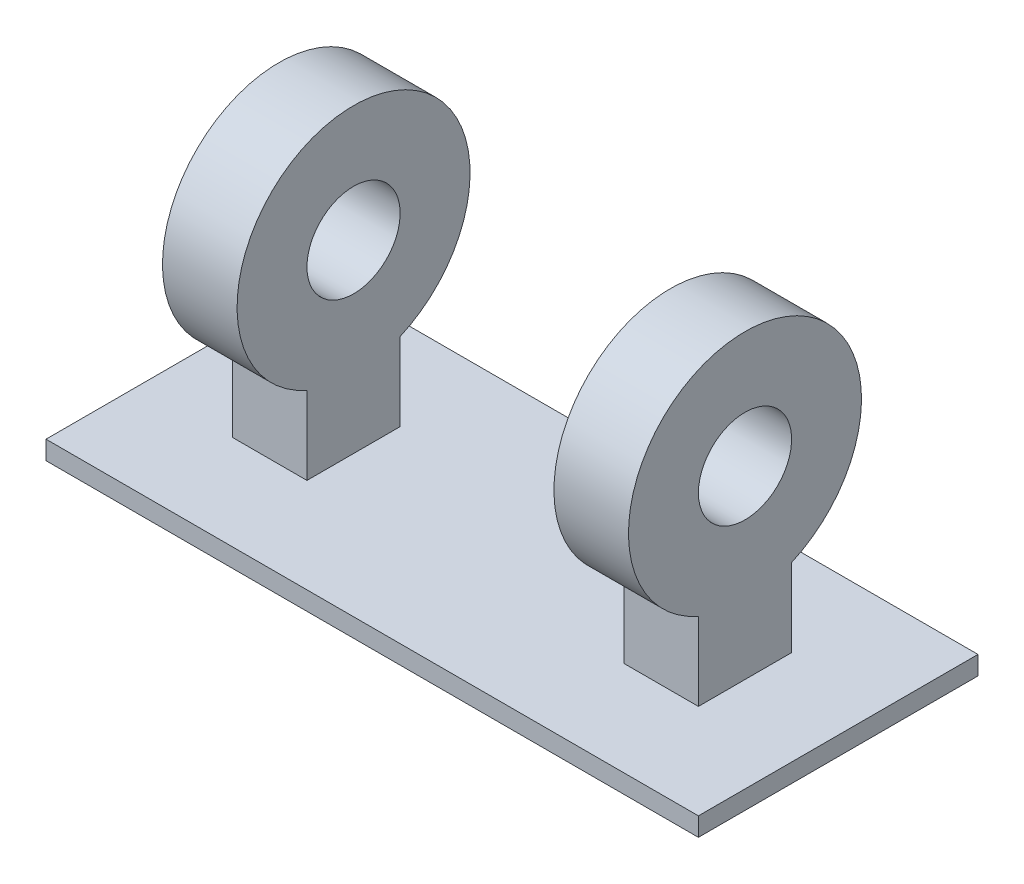
ISO-10303-21;
HEADER;
FILE_DESCRIPTION(('STEP AP214'),'2;1');
FILE_NAME('part.step','',(''),(''),'','','');
FILE_SCHEMA(('AUTOMOTIVE_DESIGN { 1 0 10303 214 1 1 1 1 }'));
ENDSEC;
DATA;
#1=APPLICATION_CONTEXT('core data for automotive mechanical design processes');
#2=APPLICATION_PROTOCOL_DEFINITION('international standard','automotive_design',2000,#1);
#3=PRODUCT_CONTEXT('',#1,'mechanical');
#4=PRODUCT('Part','Part','',(#3));
#5=PRODUCT_RELATED_PRODUCT_CATEGORY('part','',(#4));
#6=PRODUCT_DEFINITION_FORMATION('','',#4);
#7=PRODUCT_DEFINITION_CONTEXT('part definition',#1,'design');
#8=PRODUCT_DEFINITION('design','',#6,#7);
#9=PRODUCT_DEFINITION_SHAPE('','',#8);
#10=(LENGTH_UNIT() NAMED_UNIT(*) SI_UNIT(.MILLI.,.METRE.));
#11=(NAMED_UNIT(*) PLANE_ANGLE_UNIT() SI_UNIT($,.RADIAN.));
#12=(NAMED_UNIT(*) SI_UNIT($,.STERADIAN.) SOLID_ANGLE_UNIT());
#13=UNCERTAINTY_MEASURE_WITH_UNIT(LENGTH_MEASURE(1.E-05),#10,'distance_accuracy_value','');
#14=(GEOMETRIC_REPRESENTATION_CONTEXT(3) GLOBAL_UNCERTAINTY_ASSIGNED_CONTEXT((#13)) GLOBAL_UNIT_ASSIGNED_CONTEXT((#10,
#11,#12)) REPRESENTATION_CONTEXT('',''));
#15=CARTESIAN_POINT('',(0.,0.,0.));
#16=DIRECTION('',(0.,0.,1.));
#17=DIRECTION('',(1.,0.,0.));
#18=AXIS2_PLACEMENT_3D('',#15,#16,#17);
#19=CARTESIAN_POINT('',(17.,2.16649323295984,-5.));
#20=DIRECTION('',(0.,-1.,0.));
#21=DIRECTION('',(0.,0.,-1.));
#22=AXIS2_PLACEMENT_3D('',#19,#20,#21);
#23=PLANE('',#22);
#24=DIRECTION('',(0.,0.,1.));
#25=VECTOR('',#24,1.);
#26=CARTESIAN_POINT('',(25.,2.16649323295984,-5.));
#27=LINE('',#26,#25);
#28=CARTESIAN_POINT('',(25.,2.16649323295984,-5.));
#29=VERTEX_POINT('',#28);
#30=CARTESIAN_POINT('',(25.,2.16649323295984,5.));
#31=VERTEX_POINT('',#30);
#32=EDGE_CURVE('E107',#29,#31,#27,.T.);
#33=ORIENTED_EDGE('',*,*,#32,.T.);
#34=DIRECTION('',(1.,0.,0.));
#35=VECTOR('',#34,1.);
#36=CARTESIAN_POINT('',(17.,2.16649323295984,5.));
#37=LINE('',#36,#35);
#38=CARTESIAN_POINT('',(17.,2.16649323295984,5.));
#39=VERTEX_POINT('',#38);
#40=EDGE_CURVE('E46',#39,#31,#37,.T.);
#41=ORIENTED_EDGE('',*,*,#40,.F.);
#42=DIRECTION('',(0.,0.,1.));
#43=VECTOR('',#42,1.);
#44=CARTESIAN_POINT('',(17.,2.16649323295984,-5.));
#45=LINE('',#44,#43);
#46=CARTESIAN_POINT('',(17.,2.16649323295984,-5.));
#47=VERTEX_POINT('',#46);
#48=EDGE_CURVE('E96',#47,#39,#45,.T.);
#49=ORIENTED_EDGE('',*,*,#48,.F.);
#50=DIRECTION('',(1.,0.,0.));
#51=VECTOR('',#50,1.);
#52=CARTESIAN_POINT('',(17.,2.16649323295984,-5.));
#53=LINE('',#52,#51);
#54=EDGE_CURVE('E12',#47,#29,#53,.T.);
#55=ORIENTED_EDGE('',*,*,#54,.T.);
#56=EDGE_LOOP('',(#33,#41,#49,#55));
#57=FACE_BOUND('',#56,.T.);
#58=ADVANCED_FACE('F43',(#57),#23,.T.);
#59=CARTESIAN_POINT('',(17.,7.0571670620286,-5.));
#60=DIRECTION('',(0.,0.,-1.));
#61=DIRECTION('',(1.,0.,0.));
#62=AXIS2_PLACEMENT_3D('',#59,#60,#61);
#63=PLANE('',#62);
#64=DIRECTION('',(0.,-1.,0.));
#65=VECTOR('',#64,1.);
#66=CARTESIAN_POINT('',(25.,7.0571670620286,-5.));
#67=LINE('',#66,#65);
#68=CARTESIAN_POINT('',(25.,10.5435607626104,-5.));
#69=VERTEX_POINT('',#68);
#70=EDGE_CURVE('E84',#69,#29,#67,.T.);
#71=ORIENTED_EDGE('',*,*,#70,.T.);
#72=ORIENTED_EDGE('',*,*,#54,.F.);
#73=DIRECTION('',(0.,-1.,0.));
#74=VECTOR('',#73,1.);
#75=CARTESIAN_POINT('',(17.,10.5435607626104,-5.));
#76=LINE('',#75,#74);
#77=CARTESIAN_POINT('',(17.,10.5435607626104,-5.));
#78=VERTEX_POINT('',#77);
#79=EDGE_CURVE('E61',#78,#47,#76,.T.);
#80=ORIENTED_EDGE('',*,*,#79,.F.);
#81=DIRECTION('',(1.,0.,0.));
#82=VECTOR('',#81,1.);
#83=CARTESIAN_POINT('',(17.,10.5435607626104,-5.));
#84=LINE('',#83,#82);
#85=EDGE_CURVE('E52',#78,#69,#84,.T.);
#86=ORIENTED_EDGE('',*,*,#85,.T.);
#87=EDGE_LOOP('',(#71,#72,#80,#86));
#88=FACE_BOUND('',#87,.T.);
#89=ADVANCED_FACE('F114',(#88),#63,.T.);
#90=CARTESIAN_POINT('',(17.,22.,0.));
#91=DIRECTION('',(1.,0.,0.));
#92=DIRECTION('',(0.,0.,1.));
#93=AXIS2_PLACEMENT_3D('',#90,#91,#92);
#94=CYLINDRICAL_SURFACE('',#93,12.5);
#95=CARTESIAN_POINT('',(25.,22.,0.));
#96=DIRECTION('',(-1.,0.,0.));
#97=DIRECTION('',(0.,0.,1.));
#98=AXIS2_PLACEMENT_3D('',#95,#96,#97);
#99=CIRCLE('',#98,12.5);
#100=CARTESIAN_POINT('',(25.,10.5435607626104,5.));
#101=VERTEX_POINT('',#100);
#102=EDGE_CURVE('E78',#101,#69,#99,.T.);
#103=ORIENTED_EDGE('',*,*,#102,.T.);
#104=ORIENTED_EDGE('',*,*,#85,.F.);
#105=CARTESIAN_POINT('',(17.,22.,0.));
#106=DIRECTION('',(-1.,0.,0.));
#107=DIRECTION('',(0.,0.,1.));
#108=AXIS2_PLACEMENT_3D('',#105,#106,#107);
#109=CIRCLE('',#108,12.5);
#110=CARTESIAN_POINT('',(17.,10.5435607626104,5.));
#111=VERTEX_POINT('',#110);
#112=EDGE_CURVE('E94',#111,#78,#109,.T.);
#113=ORIENTED_EDGE('',*,*,#112,.F.);
#114=DIRECTION('',(1.,0.,0.));
#115=VECTOR('',#114,1.);
#116=CARTESIAN_POINT('',(17.,10.5435607626104,5.));
#117=LINE('',#116,#115);
#118=EDGE_CURVE('E99',#111,#101,#117,.T.);
#119=ORIENTED_EDGE('',*,*,#118,.T.);
#120=EDGE_LOOP('',(#103,#104,#113,#119));
#121=FACE_BOUND('',#120,.T.);
#122=ADVANCED_FACE('F102',(#121),#94,.T.);
#123=CARTESIAN_POINT('',(17.,7.0571670620286,5.));
#124=DIRECTION('',(0.,0.,1.));
#125=DIRECTION('',(-1.,0.,0.));
#126=AXIS2_PLACEMENT_3D('',#123,#124,#125);
#127=PLANE('',#126);
#128=DIRECTION('',(0.,1.,0.));
#129=VECTOR('',#128,1.);
#130=CARTESIAN_POINT('',(25.,7.0571670620286,5.));
#131=LINE('',#130,#129);
#132=EDGE_CURVE('E101',#31,#101,#131,.T.);
#133=ORIENTED_EDGE('',*,*,#132,.T.);
#134=ORIENTED_EDGE('',*,*,#118,.F.);
#135=DIRECTION('',(0.,1.,0.));
#136=VECTOR('',#135,1.);
#137=CARTESIAN_POINT('',(17.,2.16649323295984,5.));
#138=LINE('',#137,#136);
#139=EDGE_CURVE('E91',#39,#111,#138,.T.);
#140=ORIENTED_EDGE('',*,*,#139,.F.);
#141=ORIENTED_EDGE('',*,*,#40,.T.);
#142=EDGE_LOOP('',(#133,#134,#140,#141));
#143=FACE_BOUND('',#142,.T.);
#144=ADVANCED_FACE('F100',(#143),#127,.T.);
#145=CARTESIAN_POINT('',(17.,22.,0.));
#146=DIRECTION('',(1.,0.,0.));
#147=DIRECTION('',(0.,0.,1.));
#148=AXIS2_PLACEMENT_3D('',#145,#146,#147);
#149=PLANE('',#148);
#150=CARTESIAN_POINT('',(17.,22.,0.));
#151=DIRECTION('',(-1.,0.,0.));
#152=DIRECTION('',(0.,0.,1.));
#153=AXIS2_PLACEMENT_3D('',#150,#151,#152);
#154=CIRCLE('',#153,5.);
#155=CARTESIAN_POINT('',(17.,22.,5.));
#156=VERTEX_POINT('',#155);
#157=EDGE_CURVE('E110',#156,#156,#154,.T.);
#158=ORIENTED_EDGE('',*,*,#157,.F.);
#159=EDGE_LOOP('',(#158));
#160=FACE_BOUND('',#159,.T.);
#161=ORIENTED_EDGE('',*,*,#48,.T.);
#162=ORIENTED_EDGE('',*,*,#139,.T.);
#163=ORIENTED_EDGE('',*,*,#112,.T.);
#164=ORIENTED_EDGE('',*,*,#79,.T.);
#165=EDGE_LOOP('',(#161,#162,#163,#164));
#166=FACE_BOUND('',#165,.T.);
#167=ADVANCED_FACE('F92',(#160,#166),#149,.F.);
#168=CARTESIAN_POINT('',(25.,22.,0.));
#169=DIRECTION('',(1.,0.,0.));
#170=DIRECTION('',(0.,0.,1.));
#171=AXIS2_PLACEMENT_3D('',#168,#169,#170);
#172=PLANE('',#171);
#173=CARTESIAN_POINT('',(25.,22.,0.));
#174=DIRECTION('',(-1.,0.,0.));
#175=DIRECTION('',(0.,0.,1.));
#176=AXIS2_PLACEMENT_3D('',#173,#174,#175);
#177=CIRCLE('',#176,5.);
#178=CARTESIAN_POINT('',(25.,22.,5.));
#179=VERTEX_POINT('',#178);
#180=EDGE_CURVE('E120',#179,#179,#177,.T.);
#181=ORIENTED_EDGE('',*,*,#180,.T.);
#182=EDGE_LOOP('',(#181));
#183=FACE_BOUND('',#182,.T.);
#184=ORIENTED_EDGE('',*,*,#32,.F.);
#185=ORIENTED_EDGE('',*,*,#70,.F.);
#186=ORIENTED_EDGE('',*,*,#102,.F.);
#187=ORIENTED_EDGE('',*,*,#132,.F.);
#188=EDGE_LOOP('',(#184,#185,#186,#187));
#189=FACE_BOUND('',#188,.T.);
#190=ADVANCED_FACE('F117',(#183,#189),#172,.T.);
#191=CARTESIAN_POINT('',(17.,22.,0.));
#192=DIRECTION('',(1.,0.,0.));
#193=DIRECTION('',(0.,0.,1.));
#194=AXIS2_PLACEMENT_3D('',#191,#192,#193);
#195=CYLINDRICAL_SURFACE('',#194,5.);
#196=ORIENTED_EDGE('',*,*,#157,.T.);
#197=EDGE_LOOP('',(#196));
#198=FACE_BOUND('',#197,.T.);
#199=ORIENTED_EDGE('',*,*,#180,.F.);
#200=EDGE_LOOP('',(#199));
#201=FACE_BOUND('',#200,.T.);
#202=ADVANCED_FACE('F126',(#198,#201),#195,.F.);
#203=CLOSED_SHELL('',(#58,#89,#122,#144,#167,#190,#202));
#204=MANIFOLD_SOLID_BREP('B2',#203);
#205=CARTESIAN_POINT('',(-17.,2.16649323295984,-5.));
#206=DIRECTION('',(0.,-1.,0.));
#207=DIRECTION('',(0.,0.,-1.));
#208=AXIS2_PLACEMENT_3D('',#205,#206,#207);
#209=PLANE('',#208);
#210=DIRECTION('',(0.,0.,1.));
#211=VECTOR('',#210,1.);
#212=CARTESIAN_POINT('',(-25.,2.16649323295984,-5.));
#213=LINE('',#212,#211);
#214=CARTESIAN_POINT('',(-25.,2.16649323295984,-5.));
#215=VERTEX_POINT('',#214);
#216=CARTESIAN_POINT('',(-25.,2.16649323295984,5.));
#217=VERTEX_POINT('',#216);
#218=EDGE_CURVE('E266',#215,#217,#213,.T.);
#219=ORIENTED_EDGE('',*,*,#218,.F.);
#220=DIRECTION('',(-1.,0.,0.));
#221=VECTOR('',#220,1.);
#222=CARTESIAN_POINT('',(-17.,2.16649323295984,-5.));
#223=LINE('',#222,#221);
#224=CARTESIAN_POINT('',(-17.,2.16649323295984,-5.));
#225=VERTEX_POINT('',#224);
#226=EDGE_CURVE('E41',#225,#215,#223,.T.);
#227=ORIENTED_EDGE('',*,*,#226,.F.);
#228=DIRECTION('',(0.,0.,1.));
#229=VECTOR('',#228,1.);
#230=CARTESIAN_POINT('',(-17.,2.16649323295984,-5.));
#231=LINE('',#230,#229);
#232=CARTESIAN_POINT('',(-17.,2.16649323295984,5.));
#233=VERTEX_POINT('',#232);
#234=EDGE_CURVE('E253',#225,#233,#231,.T.);
#235=ORIENTED_EDGE('',*,*,#234,.T.);
#236=DIRECTION('',(-1.,0.,0.));
#237=VECTOR('',#236,1.);
#238=CARTESIAN_POINT('',(-17.,2.16649323295984,5.));
#239=LINE('',#238,#237);
#240=EDGE_CURVE('E205',#233,#217,#239,.T.);
#241=ORIENTED_EDGE('',*,*,#240,.T.);
#242=EDGE_LOOP('',(#219,#227,#235,#241));
#243=FACE_BOUND('',#242,.T.);
#244=ADVANCED_FACE('F202',(#243),#209,.T.);
#245=CARTESIAN_POINT('',(-17.,7.0571670620286,-5.));
#246=DIRECTION('',(0.,0.,-1.));
#247=DIRECTION('',(-1.,0.,0.));
#248=AXIS2_PLACEMENT_3D('',#245,#246,#247);
#249=PLANE('',#248);
#250=DIRECTION('',(0.,-1.,0.));
#251=VECTOR('',#250,1.);
#252=CARTESIAN_POINT('',(-25.,7.0571670620286,-5.));
#253=LINE('',#252,#251);
#254=CARTESIAN_POINT('',(-25.,10.5435607626104,-5.));
#255=VERTEX_POINT('',#254);
#256=EDGE_CURVE('E233',#255,#215,#253,.T.);
#257=ORIENTED_EDGE('',*,*,#256,.F.);
#258=DIRECTION('',(-1.,0.,0.));
#259=VECTOR('',#258,1.);
#260=CARTESIAN_POINT('',(-17.,10.5435607626104,-5.));
#261=LINE('',#260,#259);
#262=CARTESIAN_POINT('',(-17.,10.5435607626104,-5.));
#263=VERTEX_POINT('',#262);
#264=EDGE_CURVE('E211',#263,#255,#261,.T.);
#265=ORIENTED_EDGE('',*,*,#264,.F.);
#266=DIRECTION('',(0.,-1.,0.));
#267=VECTOR('',#266,1.);
#268=CARTESIAN_POINT('',(-17.,10.5435607626104,-5.));
#269=LINE('',#268,#267);
#270=EDGE_CURVE('E219',#263,#225,#269,.T.);
#271=ORIENTED_EDGE('',*,*,#270,.T.);
#272=ORIENTED_EDGE('',*,*,#226,.T.);
#273=EDGE_LOOP('',(#257,#265,#271,#272));
#274=FACE_BOUND('',#273,.T.);
#275=ADVANCED_FACE('F299',(#274),#249,.T.);
#276=CARTESIAN_POINT('',(-17.,22.,0.));
#277=DIRECTION('',(-1.,0.,0.));
#278=DIRECTION('',(0.,0.,1.));
#279=AXIS2_PLACEMENT_3D('',#276,#277,#278);
#280=CYLINDRICAL_SURFACE('',#279,12.5);
#281=CARTESIAN_POINT('',(-25.,22.,0.));
#282=DIRECTION('',(-1.,0.,0.));
#283=DIRECTION('',(0.,0.,1.));
#284=AXIS2_PLACEMENT_3D('',#281,#282,#283);
#285=CIRCLE('',#284,12.5);
#286=CARTESIAN_POINT('',(-25.,10.5435607626104,5.));
#287=VERTEX_POINT('',#286);
#288=EDGE_CURVE('E259',#287,#255,#285,.T.);
#289=ORIENTED_EDGE('',*,*,#288,.F.);
#290=DIRECTION('',(-1.,0.,0.));
#291=VECTOR('',#290,1.);
#292=CARTESIAN_POINT('',(-17.,10.5435607626104,5.));
#293=LINE('',#292,#291);
#294=CARTESIAN_POINT('',(-17.,10.5435607626104,5.));
#295=VERTEX_POINT('',#294);
#296=EDGE_CURVE('E246',#295,#287,#293,.T.);
#297=ORIENTED_EDGE('',*,*,#296,.F.);
#298=CARTESIAN_POINT('',(-17.,22.,0.));
#299=DIRECTION('',(-1.,0.,0.));
#300=DIRECTION('',(0.,0.,1.));
#301=AXIS2_PLACEMENT_3D('',#298,#299,#300);
#302=CIRCLE('',#301,12.5);
#303=EDGE_CURVE('E252',#295,#263,#302,.T.);
#304=ORIENTED_EDGE('',*,*,#303,.T.);
#305=ORIENTED_EDGE('',*,*,#264,.T.);
#306=EDGE_LOOP('',(#289,#297,#304,#305));
#307=FACE_BOUND('',#306,.T.);
#308=ADVANCED_FACE('F257',(#307),#280,.T.);
#309=CARTESIAN_POINT('',(-17.,7.0571670620286,5.));
#310=DIRECTION('',(0.,0.,1.));
#311=DIRECTION('',(1.,0.,0.));
#312=AXIS2_PLACEMENT_3D('',#309,#310,#311);
#313=PLANE('',#312);
#314=DIRECTION('',(0.,1.,0.));
#315=VECTOR('',#314,1.);
#316=CARTESIAN_POINT('',(-25.,7.0571670620286,5.));
#317=LINE('',#316,#315);
#318=EDGE_CURVE('E269',#217,#287,#317,.T.);
#319=ORIENTED_EDGE('',*,*,#318,.F.);
#320=ORIENTED_EDGE('',*,*,#240,.F.);
#321=DIRECTION('',(0.,1.,0.));
#322=VECTOR('',#321,1.);
#323=CARTESIAN_POINT('',(-17.,2.16649323295984,5.));
#324=LINE('',#323,#322);
#325=EDGE_CURVE('E243',#233,#295,#324,.T.);
#326=ORIENTED_EDGE('',*,*,#325,.T.);
#327=ORIENTED_EDGE('',*,*,#296,.T.);
#328=EDGE_LOOP('',(#319,#320,#326,#327));
#329=FACE_BOUND('',#328,.T.);
#330=ADVANCED_FACE('F245',(#329),#313,.T.);
#331=CARTESIAN_POINT('',(-17.,22.,0.));
#332=DIRECTION('',(-1.,0.,0.));
#333=DIRECTION('',(0.,0.,1.));
#334=AXIS2_PLACEMENT_3D('',#331,#332,#333);
#335=PLANE('',#334);
#336=CARTESIAN_POINT('',(-17.,22.,0.));
#337=DIRECTION('',(-1.,0.,0.));
#338=DIRECTION('',(0.,0.,1.));
#339=AXIS2_PLACEMENT_3D('',#336,#337,#338);
#340=CIRCLE('',#339,5.);
#341=CARTESIAN_POINT('',(-17.,22.,5.));
#342=VERTEX_POINT('',#341);
#343=EDGE_CURVE('E270',#342,#342,#340,.T.);
#344=ORIENTED_EDGE('',*,*,#343,.T.);
#345=EDGE_LOOP('',(#344));
#346=FACE_BOUND('',#345,.T.);
#347=ORIENTED_EDGE('',*,*,#234,.F.);
#348=ORIENTED_EDGE('',*,*,#270,.F.);
#349=ORIENTED_EDGE('',*,*,#303,.F.);
#350=ORIENTED_EDGE('',*,*,#325,.F.);
#351=EDGE_LOOP('',(#347,#348,#349,#350));
#352=FACE_BOUND('',#351,.T.);
#353=ADVANCED_FACE('F261',(#346,#352),#335,.F.);
#354=CARTESIAN_POINT('',(-25.,22.,0.));
#355=DIRECTION('',(-1.,0.,0.));
#356=DIRECTION('',(0.,0.,1.));
#357=AXIS2_PLACEMENT_3D('',#354,#355,#356);
#358=PLANE('',#357);
#359=CARTESIAN_POINT('',(-25.,22.,0.));
#360=DIRECTION('',(-1.,0.,0.));
#361=DIRECTION('',(0.,0.,1.));
#362=AXIS2_PLACEMENT_3D('',#359,#360,#361);
#363=CIRCLE('',#362,5.);
#364=CARTESIAN_POINT('',(-25.,22.,5.));
#365=VERTEX_POINT('',#364);
#366=EDGE_CURVE('E278',#365,#365,#363,.T.);
#367=ORIENTED_EDGE('',*,*,#366,.F.);
#368=EDGE_LOOP('',(#367));
#369=FACE_BOUND('',#368,.T.);
#370=ORIENTED_EDGE('',*,*,#218,.T.);
#371=ORIENTED_EDGE('',*,*,#318,.T.);
#372=ORIENTED_EDGE('',*,*,#288,.T.);
#373=ORIENTED_EDGE('',*,*,#256,.T.);
#374=EDGE_LOOP('',(#370,#371,#372,#373));
#375=FACE_BOUND('',#374,.T.);
#376=ADVANCED_FACE('F275',(#369,#375),#358,.T.);
#377=CARTESIAN_POINT('',(-17.,22.,0.));
#378=DIRECTION('',(-1.,0.,0.));
#379=DIRECTION('',(0.,0.,1.));
#380=AXIS2_PLACEMENT_3D('',#377,#378,#379);
#381=CYLINDRICAL_SURFACE('',#380,5.);
#382=ORIENTED_EDGE('',*,*,#343,.F.);
#383=EDGE_LOOP('',(#382));
#384=FACE_BOUND('',#383,.T.);
#385=ORIENTED_EDGE('',*,*,#366,.T.);
#386=EDGE_LOOP('',(#385));
#387=FACE_BOUND('',#386,.T.);
#388=ADVANCED_FACE('F285',(#384,#387),#381,.F.);
#389=CLOSED_SHELL('',(#244,#275,#308,#330,#353,#376,#388));
#390=MANIFOLD_SOLID_BREP('B6',#389);
#391=CARTESIAN_POINT('',(35.,2.,15.));
#392=DIRECTION('',(-1.,0.,0.));
#393=DIRECTION('',(0.,0.,1.));
#394=AXIS2_PLACEMENT_3D('',#391,#392,#393);
#395=PLANE('',#394);
#396=DIRECTION('',(0.,0.,-1.));
#397=VECTOR('',#396,1.);
#398=CARTESIAN_POINT('',(35.,0.,15.));
#399=LINE('',#398,#397);
#400=CARTESIAN_POINT('',(35.,0.,15.));
#401=VERTEX_POINT('',#400);
#402=CARTESIAN_POINT('',(35.,0.,-15.));
#403=VERTEX_POINT('',#402);
#404=EDGE_CURVE('E415',#401,#403,#399,.T.);
#405=ORIENTED_EDGE('',*,*,#404,.T.);
#406=DIRECTION('',(0.,-1.,0.));
#407=VECTOR('',#406,1.);
#408=CARTESIAN_POINT('',(35.,2.,-15.));
#409=LINE('',#408,#407);
#410=CARTESIAN_POINT('',(35.,2.,-15.));
#411=VERTEX_POINT('',#410);
#412=EDGE_CURVE('E200',#411,#403,#409,.T.);
#413=ORIENTED_EDGE('',*,*,#412,.F.);
#414=DIRECTION('',(0.,0.,-1.));
#415=VECTOR('',#414,1.);
#416=CARTESIAN_POINT('',(35.,2.,15.));
#417=LINE('',#416,#415);
#418=CARTESIAN_POINT('',(35.,2.,15.));
#419=VERTEX_POINT('',#418);
#420=EDGE_CURVE('E403',#419,#411,#417,.T.);
#421=ORIENTED_EDGE('',*,*,#420,.F.);
#422=DIRECTION('',(0.,-1.,0.));
#423=VECTOR('',#422,1.);
#424=CARTESIAN_POINT('',(35.,2.,15.));
#425=LINE('',#424,#423);
#426=EDGE_CURVE('E411',#419,#401,#425,.T.);
#427=ORIENTED_EDGE('',*,*,#426,.T.);
#428=EDGE_LOOP('',(#405,#413,#421,#427));
#429=FACE_BOUND('',#428,.T.);
#430=ADVANCED_FACE('F352',(#429),#395,.F.);
#431=CARTESIAN_POINT('',(-35.,2.,-15.));
#432=DIRECTION('',(0.,0.,1.));
#433=DIRECTION('',(1.,0.,0.));
#434=AXIS2_PLACEMENT_3D('',#431,#432,#433);
#435=PLANE('',#434);
#436=DIRECTION('',(-1.,0.,0.));
#437=VECTOR('',#436,1.);
#438=CARTESIAN_POINT('',(-35.,0.,-15.));
#439=LINE('',#438,#437);
#440=CARTESIAN_POINT('',(-35.,0.,-15.));
#441=VERTEX_POINT('',#440);
#442=EDGE_CURVE('E407',#403,#441,#439,.T.);
#443=ORIENTED_EDGE('',*,*,#442,.T.);
#444=DIRECTION('',(0.,-1.,0.));
#445=VECTOR('',#444,1.);
#446=CARTESIAN_POINT('',(-35.,2.,-15.));
#447=LINE('',#446,#445);
#448=CARTESIAN_POINT('',(-35.,2.,-15.));
#449=VERTEX_POINT('',#448);
#450=EDGE_CURVE('E360',#449,#441,#447,.T.);
#451=ORIENTED_EDGE('',*,*,#450,.F.);
#452=DIRECTION('',(-1.,0.,0.));
#453=VECTOR('',#452,1.);
#454=CARTESIAN_POINT('',(-35.,2.,-15.));
#455=LINE('',#454,#453);
#456=EDGE_CURVE('E398',#411,#449,#455,.T.);
#457=ORIENTED_EDGE('',*,*,#456,.F.);
#458=ORIENTED_EDGE('',*,*,#412,.T.);
#459=EDGE_LOOP('',(#443,#451,#457,#458));
#460=FACE_BOUND('',#459,.T.);
#461=ADVANCED_FACE('F406',(#460),#435,.F.);
#462=CARTESIAN_POINT('',(-35.,2.,15.));
#463=DIRECTION('',(1.,0.,0.));
#464=DIRECTION('',(0.,0.,-1.));
#465=AXIS2_PLACEMENT_3D('',#462,#463,#464);
#466=PLANE('',#465);
#467=DIRECTION('',(0.,0.,1.));
#468=VECTOR('',#467,1.);
#469=CARTESIAN_POINT('',(-35.,0.,15.));
#470=LINE('',#469,#468);
#471=CARTESIAN_POINT('',(-35.,0.,15.));
#472=VERTEX_POINT('',#471);
#473=EDGE_CURVE('E385',#441,#472,#470,.T.);
#474=ORIENTED_EDGE('',*,*,#473,.T.);
#475=DIRECTION('',(0.,-1.,0.));
#476=VECTOR('',#475,1.);
#477=CARTESIAN_POINT('',(-35.,2.,15.));
#478=LINE('',#477,#476);
#479=CARTESIAN_POINT('',(-35.,2.,15.));
#480=VERTEX_POINT('',#479);
#481=EDGE_CURVE('E408',#480,#472,#478,.T.);
#482=ORIENTED_EDGE('',*,*,#481,.F.);
#483=DIRECTION('',(0.,0.,1.));
#484=VECTOR('',#483,1.);
#485=CARTESIAN_POINT('',(-35.,2.,15.));
#486=LINE('',#485,#484);
#487=EDGE_CURVE('E401',#449,#480,#486,.T.);
#488=ORIENTED_EDGE('',*,*,#487,.F.);
#489=ORIENTED_EDGE('',*,*,#450,.T.);
#490=EDGE_LOOP('',(#474,#482,#488,#489));
#491=FACE_BOUND('',#490,.T.);
#492=ADVANCED_FACE('F409',(#491),#466,.F.);
#493=CARTESIAN_POINT('',(-35.,2.,15.));
#494=DIRECTION('',(0.,0.,-1.));
#495=DIRECTION('',(-1.,0.,0.));
#496=AXIS2_PLACEMENT_3D('',#493,#494,#495);
#497=PLANE('',#496);
#498=DIRECTION('',(1.,0.,0.));
#499=VECTOR('',#498,1.);
#500=CARTESIAN_POINT('',(-35.,0.,15.));
#501=LINE('',#500,#499);
#502=EDGE_CURVE('E391',#472,#401,#501,.T.);
#503=ORIENTED_EDGE('',*,*,#502,.T.);
#504=ORIENTED_EDGE('',*,*,#426,.F.);
#505=DIRECTION('',(1.,0.,0.));
#506=VECTOR('',#505,1.);
#507=CARTESIAN_POINT('',(-35.,2.,15.));
#508=LINE('',#507,#506);
#509=EDGE_CURVE('E368',#480,#419,#508,.T.);
#510=ORIENTED_EDGE('',*,*,#509,.F.);
#511=ORIENTED_EDGE('',*,*,#481,.T.);
#512=EDGE_LOOP('',(#503,#504,#510,#511));
#513=FACE_BOUND('',#512,.T.);
#514=ADVANCED_FACE('F422',(#513),#497,.F.);
#515=CARTESIAN_POINT('',(0.,2.,0.));
#516=DIRECTION('',(0.,-1.,0.));
#517=DIRECTION('',(0.,0.,-1.));
#518=AXIS2_PLACEMENT_3D('',#515,#516,#517);
#519=PLANE('',#518);
#520=ORIENTED_EDGE('',*,*,#420,.T.);
#521=ORIENTED_EDGE('',*,*,#456,.T.);
#522=ORIENTED_EDGE('',*,*,#487,.T.);
#523=ORIENTED_EDGE('',*,*,#509,.T.);
#524=EDGE_LOOP('',(#520,#521,#522,#523));
#525=FACE_BOUND('',#524,.T.);
#526=ADVANCED_FACE('F399',(#525),#519,.F.);
#527=CARTESIAN_POINT('',(0.,0.,0.));
#528=DIRECTION('',(0.,-1.,0.));
#529=DIRECTION('',(0.,0.,-1.));
#530=AXIS2_PLACEMENT_3D('',#527,#528,#529);
#531=PLANE('',#530);
#532=ORIENTED_EDGE('',*,*,#404,.F.);
#533=ORIENTED_EDGE('',*,*,#502,.F.);
#534=ORIENTED_EDGE('',*,*,#473,.F.);
#535=ORIENTED_EDGE('',*,*,#442,.F.);
#536=EDGE_LOOP('',(#532,#533,#534,#535));
#537=FACE_BOUND('',#536,.T.);
#538=ADVANCED_FACE('F425',(#537),#531,.T.);
#539=CLOSED_SHELL('',(#430,#461,#492,#514,#526,#538));
#540=MANIFOLD_SOLID_BREP('B35',#539);
#541=ADVANCED_BREP_SHAPE_REPRESENTATION('',(#18,#204,#390,#540),#14);
#542=SHAPE_DEFINITION_REPRESENTATION(#9,#541);
ENDSEC;
END-ISO-10303-21;
